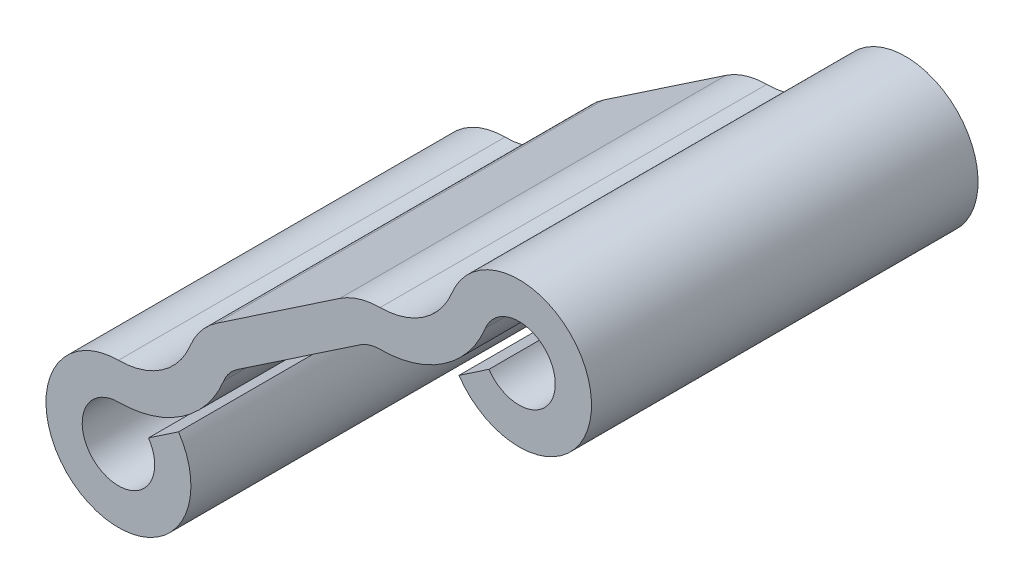
ISO-10303-21;
HEADER;
FILE_DESCRIPTION(('STEP AP214'),'2;1');
FILE_NAME('part.step','',(''),(''),'','','');
FILE_SCHEMA(('AUTOMOTIVE_DESIGN { 1 0 10303 214 1 1 1 1 }'));
ENDSEC;
DATA;
#1=APPLICATION_CONTEXT('core data for automotive mechanical design processes');
#2=APPLICATION_PROTOCOL_DEFINITION('international standard','automotive_design',2000,#1);
#3=PRODUCT_CONTEXT('',#1,'mechanical');
#4=PRODUCT('Part','Part','',(#3));
#5=PRODUCT_RELATED_PRODUCT_CATEGORY('part','',(#4));
#6=PRODUCT_DEFINITION_FORMATION('','',#4);
#7=PRODUCT_DEFINITION_CONTEXT('part definition',#1,'design');
#8=PRODUCT_DEFINITION('design','',#6,#7);
#9=PRODUCT_DEFINITION_SHAPE('','',#8);
#10=(LENGTH_UNIT() NAMED_UNIT(*) SI_UNIT(.MILLI.,.METRE.));
#11=(NAMED_UNIT(*) PLANE_ANGLE_UNIT() SI_UNIT($,.RADIAN.));
#12=(NAMED_UNIT(*) SI_UNIT($,.STERADIAN.) SOLID_ANGLE_UNIT());
#13=UNCERTAINTY_MEASURE_WITH_UNIT(LENGTH_MEASURE(1.E-05),#10,'distance_accuracy_value','');
#14=(GEOMETRIC_REPRESENTATION_CONTEXT(3) GLOBAL_UNCERTAINTY_ASSIGNED_CONTEXT((#13)) GLOBAL_UNIT_ASSIGNED_CONTEXT((#10,
#11,#12)) REPRESENTATION_CONTEXT('',''));
#15=CARTESIAN_POINT('',(0.,0.,0.));
#16=DIRECTION('',(0.,0.,1.));
#17=DIRECTION('',(1.,0.,0.));
#18=AXIS2_PLACEMENT_3D('',#15,#16,#17);
#19=CARTESIAN_POINT('',(0.,6.2,8.));
#20=DIRECTION('',(0.,0.,-1.));
#21=DIRECTION('',(0.927183854566791,-0.374606593415903,0.));
#22=AXIS2_PLACEMENT_3D('',#19,#20,#21);
#23=CYLINDRICAL_SURFACE('',#22,3.20000000000003);
#24=CARTESIAN_POINT('',(0.,6.2,-8.));
#25=DIRECTION('',(0.,0.,-1.));
#26=DIRECTION('',(0.927183854566791,-0.374606593415903,0.));
#27=AXIS2_PLACEMENT_3D('',#24,#25,#26);
#28=CIRCLE('',#27,3.20000000000003);
#29=CARTESIAN_POINT('',(0.,2.99999999999997,-8.));
#30=VERTEX_POINT('',#29);
#31=CARTESIAN_POINT('',(2.96698833461371,5.0012589010691,-8.));
#32=VERTEX_POINT('',#31);
#33=EDGE_CURVE('E127',#30,#32,#28,.F.);
#34=ORIENTED_EDGE('',*,*,#33,.F.);
#35=DIRECTION('',(0.,0.,1.));
#36=VECTOR('',#35,1.);
#37=CARTESIAN_POINT('',(0.,2.99999999999997,-8.));
#38=LINE('',#37,#36);
#39=CARTESIAN_POINT('',(0.,2.99999999999997,8.));
#40=VERTEX_POINT('',#39);
#41=EDGE_CURVE('E139',#40,#30,#38,.F.);
#42=ORIENTED_EDGE('',*,*,#41,.F.);
#43=CARTESIAN_POINT('',(0.,6.2,8.));
#44=DIRECTION('',(0.,0.,1.));
#45=DIRECTION('',(0.,-1.,0.));
#46=AXIS2_PLACEMENT_3D('',#43,#44,#45);
#47=CIRCLE('',#46,3.20000000000003);
#48=CARTESIAN_POINT('',(2.96698833461371,5.00125890106909,8.));
#49=VERTEX_POINT('',#48);
#50=EDGE_CURVE('E144',#40,#49,#47,.T.);
#51=ORIENTED_EDGE('',*,*,#50,.T.);
#52=DIRECTION('',(0.,0.,-1.));
#53=VECTOR('',#52,1.);
#54=CARTESIAN_POINT('',(2.96698833461371,5.00125890106909,8.));
#55=LINE('',#54,#53);
#56=EDGE_CURVE('E141',#49,#32,#55,.T.);
#57=ORIENTED_EDGE('',*,*,#56,.T.);
#58=EDGE_LOOP('',(#34,#42,#51,#57));
#59=FACE_BOUND('',#58,.T.);
#60=ADVANCED_FACE('F17',(#59),#23,.F.);
#61=CARTESIAN_POINT('',(5.7485398983147,3.87743912082089,8.));
#62=DIRECTION('',(0.,0.,-1.));
#63=DIRECTION('',(-0.927183854566763,0.374606593415972,0.));
#64=AXIS2_PLACEMENT_3D('',#61,#62,#63);
#65=CYLINDRICAL_SURFACE('',#64,3.00000000000077);
#66=CARTESIAN_POINT('',(5.7485398983147,3.87743912082089,-8.));
#67=DIRECTION('',(0.,0.,1.));
#68=DIRECTION('',(-0.559192903470824,0.82903757255499,0.));
#69=AXIS2_PLACEMENT_3D('',#66,#67,#68);
#70=CIRCLE('',#69,3.00000000000077);
#71=CARTESIAN_POINT('',(4.0709611879018,6.3645518384865,-8.));
#72=VERTEX_POINT('',#71);
#73=EDGE_CURVE('E155',#72,#32,#70,.T.);
#74=ORIENTED_EDGE('',*,*,#73,.T.);
#75=ORIENTED_EDGE('',*,*,#56,.F.);
#76=CARTESIAN_POINT('',(5.7485398983147,3.87743912082089,8.));
#77=DIRECTION('',(0.,0.,-1.));
#78=DIRECTION('',(-0.927183854566763,0.374606593415972,0.));
#79=AXIS2_PLACEMENT_3D('',#76,#77,#78);
#80=CIRCLE('',#79,3.00000000000077);
#81=CARTESIAN_POINT('',(4.0709611879018,6.3645518384865,8.));
#82=VERTEX_POINT('',#81);
#83=EDGE_CURVE('E159',#82,#49,#80,.F.);
#84=ORIENTED_EDGE('',*,*,#83,.F.);
#85=DIRECTION('',(0.,0.,-1.));
#86=VECTOR('',#85,1.);
#87=CARTESIAN_POINT('',(4.0709611879018,6.3645518384865,8.));
#88=LINE('',#87,#86);
#89=EDGE_CURVE('E163',#82,#72,#88,.T.);
#90=ORIENTED_EDGE('',*,*,#89,.T.);
#91=EDGE_LOOP('',(#74,#75,#84,#90));
#92=FACE_BOUND('',#91,.T.);
#93=ADVANCED_FACE('F403',(#92),#65,.T.);
#94=CARTESIAN_POINT('',(4.0709611879018,6.3645518384865,-8.));
#95=DIRECTION('',(-0.559192903470739,0.829037572555047,0.));
#96=DIRECTION('',(0.,0.,1.));
#97=AXIS2_PLACEMENT_3D('',#94,#95,#96);
#98=PLANE('',#97);
#99=DIRECTION('',(-0.829037572555047,-0.559192903470739,0.));
#100=VECTOR('',#99,1.);
#101=CARTESIAN_POINT('',(9.1546328423745,9.7935316662587,-8.));
#102=LINE('',#101,#100);
#103=CARTESIAN_POINT('',(9.1546328423745,9.7935316662587,-8.));
#104=VERTEX_POINT('',#103);
#105=EDGE_CURVE('E168',#104,#72,#102,.T.);
#106=ORIENTED_EDGE('',*,*,#105,.T.);
#107=ORIENTED_EDGE('',*,*,#89,.F.);
#108=DIRECTION('',(0.829037572555047,0.559192903470739,0.));
#109=VECTOR('',#108,1.);
#110=CARTESIAN_POINT('',(4.0709611879018,6.3645518384865,8.));
#111=LINE('',#110,#109);
#112=CARTESIAN_POINT('',(9.1546328423745,9.7935316662587,8.));
#113=VERTEX_POINT('',#112);
#114=EDGE_CURVE('E173',#113,#82,#111,.F.);
#115=ORIENTED_EDGE('',*,*,#114,.F.);
#116=DIRECTION('',(0.,0.,-1.));
#117=VECTOR('',#116,1.);
#118=CARTESIAN_POINT('',(9.1546328423745,9.7935316662587,8.));
#119=LINE('',#118,#117);
#120=EDGE_CURVE('E177',#113,#104,#119,.T.);
#121=ORIENTED_EDGE('',*,*,#120,.T.);
#122=EDGE_LOOP('',(#106,#107,#115,#121));
#123=FACE_BOUND('',#122,.T.);
#124=ADVANCED_FACE('F399',(#123),#98,.T.);
#125=CARTESIAN_POINT('',(10.8322115527868,7.30641894859602,8.));
#126=DIRECTION('',(0.,0.,-1.));
#127=DIRECTION('',(-0.559192903471129,0.829037572554784,0.));
#128=AXIS2_PLACEMENT_3D('',#125,#126,#127);
#129=CYLINDRICAL_SURFACE('',#128,2.99999999999799);
#130=CARTESIAN_POINT('',(10.8322115527868,7.30641894859602,-8.));
#131=DIRECTION('',(0.,0.,1.));
#132=DIRECTION('',(0.,1.,0.));
#133=AXIS2_PLACEMENT_3D('',#130,#131,#132);
#134=CIRCLE('',#133,2.99999999999799);
#135=CARTESIAN_POINT('',(10.832211552787,10.306418948594,-8.));
#136=VERTEX_POINT('',#135);
#137=EDGE_CURVE('E182',#136,#104,#134,.T.);
#138=ORIENTED_EDGE('',*,*,#137,.T.);
#139=ORIENTED_EDGE('',*,*,#120,.F.);
#140=CARTESIAN_POINT('',(10.8322115527868,7.30641894859602,8.));
#141=DIRECTION('',(0.,0.,-1.));
#142=DIRECTION('',(-0.559192903471129,0.829037572554784,0.));
#143=AXIS2_PLACEMENT_3D('',#140,#141,#142);
#144=CIRCLE('',#143,2.99999999999799);
#145=CARTESIAN_POINT('',(10.832211552787,10.306418948594,8.));
#146=VERTEX_POINT('',#145);
#147=EDGE_CURVE('E187',#146,#113,#144,.F.);
#148=ORIENTED_EDGE('',*,*,#147,.F.);
#149=DIRECTION('',(0.,0.,-1.));
#150=VECTOR('',#149,1.);
#151=CARTESIAN_POINT('',(10.832211552787,10.306418948594,8.));
#152=LINE('',#151,#150);
#153=EDGE_CURVE('E191',#146,#136,#152,.T.);
#154=ORIENTED_EDGE('',*,*,#153,.T.);
#155=EDGE_LOOP('',(#138,#139,#148,#154));
#156=FACE_BOUND('',#155,.T.);
#157=ADVANCED_FACE('F397',(#156),#129,.T.);
#158=CARTESIAN_POINT('',(10.8322115527892,13.5064189485897,8.));
#159=DIRECTION('',(0.,0.,-1.));
#160=DIRECTION('',(0.927183854567117,-0.374606593415096,0.));
#161=AXIS2_PLACEMENT_3D('',#158,#159,#160);
#162=CYLINDRICAL_SURFACE('',#161,3.19999999999571);
#163=CARTESIAN_POINT('',(10.8322115527892,13.5064189485897,-8.));
#164=DIRECTION('',(0.,0.,-1.));
#165=DIRECTION('',(0.927183854567117,-0.374606593415095,0.));
#166=AXIS2_PLACEMENT_3D('',#163,#164,#165);
#167=CIRCLE('',#166,3.19999999999571);
#168=CARTESIAN_POINT('',(13.7991998874,12.307677849663,-8.));
#169=VERTEX_POINT('',#168);
#170=EDGE_CURVE('E196',#136,#169,#167,.F.);
#171=ORIENTED_EDGE('',*,*,#170,.F.);
#172=ORIENTED_EDGE('',*,*,#153,.F.);
#173=CARTESIAN_POINT('',(10.8322115527892,13.5064189485897,8.));
#174=DIRECTION('',(0.,0.,1.));
#175=DIRECTION('',(-6.87228052243893E-13,-1.,0.));
#176=AXIS2_PLACEMENT_3D('',#173,#174,#175);
#177=CIRCLE('',#176,3.19999999999571);
#178=CARTESIAN_POINT('',(13.7991998874,12.307677849663,8.));
#179=VERTEX_POINT('',#178);
#180=EDGE_CURVE('E200',#146,#179,#177,.T.);
#181=ORIENTED_EDGE('',*,*,#180,.T.);
#182=DIRECTION('',(0.,0.,-1.));
#183=VECTOR('',#182,1.);
#184=CARTESIAN_POINT('',(13.7991998874,12.307677849663,8.));
#185=LINE('',#184,#183);
#186=EDGE_CURVE('E205',#179,#169,#185,.T.);
#187=ORIENTED_EDGE('',*,*,#186,.T.);
#188=EDGE_LOOP('',(#171,#172,#181,#187));
#189=FACE_BOUND('',#188,.T.);
#190=ADVANCED_FACE('F391',(#189),#162,.F.);
#191=CARTESIAN_POINT('',(16.5807514511008,11.1838580694158,8.));
#192=DIRECTION('',(0.,0.,-1.));
#193=DIRECTION('',(0.994521893156101,0.104528484315063,0.));
#194=AXIS2_PLACEMENT_3D('',#191,#192,#193);
#195=CYLINDRICAL_SURFACE('',#194,3.00000000000025);
#196=DIRECTION('',(0.,0.,-1.));
#197=VECTOR('',#196,1.);
#198=CARTESIAN_POINT('',(14.093638733436,9.5062793590027,8.));
#199=LINE('',#198,#197);
#200=CARTESIAN_POINT('',(14.093638733436,9.5062793590027,8.));
#201=VERTEX_POINT('',#200);
#202=CARTESIAN_POINT('',(14.093638733436,9.5062793590027,-8.));
#203=VERTEX_POINT('',#202);
#204=EDGE_CURVE('E210',#201,#203,#199,.T.);
#205=ORIENTED_EDGE('',*,*,#204,.T.);
#206=CARTESIAN_POINT('',(16.5807514511008,11.1838580694158,-8.));
#207=DIRECTION('',(0.,0.,1.));
#208=DIRECTION('',(-0.82903757255488,-0.559192903470986,0.));
#209=AXIS2_PLACEMENT_3D('',#206,#207,#208);
#210=CIRCLE('',#209,3.00000000000025);
#211=EDGE_CURVE('E215',#203,#169,#210,.T.);
#212=ORIENTED_EDGE('',*,*,#211,.T.);
#213=ORIENTED_EDGE('',*,*,#186,.F.);
#214=CARTESIAN_POINT('',(16.5807514511008,11.1838580694158,8.));
#215=DIRECTION('',(0.,0.,-1.));
#216=DIRECTION('',(-0.927183854566872,0.374606593415703,0.));
#217=AXIS2_PLACEMENT_3D('',#214,#215,#216);
#218=CIRCLE('',#217,3.00000000000025);
#219=EDGE_CURVE('E220',#201,#179,#218,.F.);
#220=ORIENTED_EDGE('',*,*,#219,.F.);
#221=EDGE_LOOP('',(#205,#212,#213,#220));
#222=FACE_BOUND('',#221,.T.);
#223=ADVANCED_FACE('F388',(#222),#195,.T.);
#224=CARTESIAN_POINT('',(14.093638733436,9.5062793590027,-8.));
#225=DIRECTION('',(-0.559192903471004,0.829037572554868,0.));
#226=DIRECTION('',(0.,0.,1.));
#227=AXIS2_PLACEMENT_3D('',#224,#225,#226);
#228=PLANE('',#227);
#229=DIRECTION('',(-0.829037572554869,-0.559192903471003,0.));
#230=VECTOR('',#229,1.);
#231=CARTESIAN_POINT('',(15.337195092268,10.345068714209,-8.));
#232=LINE('',#231,#230);
#233=CARTESIAN_POINT('',(15.337195092268,10.345068714209,-8.));
#234=VERTEX_POINT('',#233);
#235=EDGE_CURVE('E224',#234,#203,#232,.T.);
#236=ORIENTED_EDGE('',*,*,#235,.T.);
#237=ORIENTED_EDGE('',*,*,#204,.F.);
#238=DIRECTION('',(0.829037572554869,0.559192903471004,0.));
#239=VECTOR('',#238,1.);
#240=CARTESIAN_POINT('',(14.093638733436,9.5062793590027,8.));
#241=LINE('',#240,#239);
#242=CARTESIAN_POINT('',(15.337195092268,10.345068714209,8.));
#243=VERTEX_POINT('',#242);
#244=EDGE_CURVE('E229',#243,#201,#241,.F.);
#245=ORIENTED_EDGE('',*,*,#244,.F.);
#246=DIRECTION('',(0.,0.,-1.));
#247=VECTOR('',#246,1.);
#248=CARTESIAN_POINT('',(15.337195092268,10.345068714209,8.));
#249=LINE('',#248,#247);
#250=EDGE_CURVE('E233',#243,#234,#249,.T.);
#251=ORIENTED_EDGE('',*,*,#250,.T.);
#252=EDGE_LOOP('',(#236,#237,#245,#251));
#253=FACE_BOUND('',#252,.T.);
#254=ADVANCED_FACE('F383',(#253),#228,.T.);
#255=CARTESIAN_POINT('',(16.5807514511008,11.1838580694145,8.));
#256=DIRECTION('',(0.,0.,-1.));
#257=DIRECTION('',(-0.927183854566606,0.374606593416361,0.));
#258=AXIS2_PLACEMENT_3D('',#255,#256,#257);
#259=CYLINDRICAL_SURFACE('',#258,1.49999999999983);
#260=DIRECTION('',(0.,0.,-1.));
#261=VECTOR('',#260,1.);
#262=CARTESIAN_POINT('',(15.189975669251,11.745767959539,8.));
#263=LINE('',#262,#261);
#264=CARTESIAN_POINT('',(15.189975669251,11.745767959539,8.));
#265=VERTEX_POINT('',#264);
#266=CARTESIAN_POINT('',(15.189975669251,11.745767959539,-8.));
#267=VERTEX_POINT('',#266);
#268=EDGE_CURVE('E238',#265,#267,#263,.T.);
#269=ORIENTED_EDGE('',*,*,#268,.T.);
#270=CARTESIAN_POINT('',(16.5807514511008,11.1838580694145,-8.));
#271=DIRECTION('',(0.,0.,-1.));
#272=DIRECTION('',(-0.927183854566606,0.374606593416361,0.));
#273=AXIS2_PLACEMENT_3D('',#270,#271,#272);
#274=CIRCLE('',#273,1.49999999999983);
#275=EDGE_CURVE('E243',#234,#267,#274,.F.);
#276=ORIENTED_EDGE('',*,*,#275,.F.);
#277=ORIENTED_EDGE('',*,*,#250,.F.);
#278=CARTESIAN_POINT('',(16.5807514511008,11.1838580694145,8.));
#279=DIRECTION('',(0.,0.,1.));
#280=DIRECTION('',(-0.829037572555266,-0.559192903470415,0.));
#281=AXIS2_PLACEMENT_3D('',#278,#279,#280);
#282=CIRCLE('',#281,1.49999999999983);
#283=EDGE_CURVE('E247',#243,#265,#282,.T.);
#284=ORIENTED_EDGE('',*,*,#283,.T.);
#285=EDGE_LOOP('',(#269,#276,#277,#284));
#286=FACE_BOUND('',#285,.T.);
#287=ADVANCED_FACE('F380',(#286),#259,.F.);
#288=CARTESIAN_POINT('',(10.8322115527861,13.506418948595,8.));
#289=DIRECTION('',(0.,0.,-1.));
#290=DIRECTION('',(0.927183854566726,-0.374606593416065,0.));
#291=AXIS2_PLACEMENT_3D('',#288,#289,#290);
#292=CYLINDRICAL_SURFACE('',#291,4.70000000000143);
#293=CARTESIAN_POINT('',(10.8322115527861,13.506418948595,-8.));
#294=DIRECTION('',(0.,0.,1.));
#295=DIRECTION('',(1.99934631498393E-13,-1.,0.));
#296=AXIS2_PLACEMENT_3D('',#293,#294,#295);
#297=CIRCLE('',#296,4.70000000000143);
#298=CARTESIAN_POINT('',(10.832211552787,8.80641894859361,-8.));
#299=VERTEX_POINT('',#298);
#300=EDGE_CURVE('E252',#299,#267,#297,.T.);
#301=ORIENTED_EDGE('',*,*,#300,.T.);
#302=ORIENTED_EDGE('',*,*,#268,.F.);
#303=CARTESIAN_POINT('',(10.8322115527861,13.506418948595,8.));
#304=DIRECTION('',(0.,0.,-1.));
#305=DIRECTION('',(0.927183854566726,-0.374606593416065,0.));
#306=AXIS2_PLACEMENT_3D('',#303,#304,#305);
#307=CIRCLE('',#306,4.70000000000143);
#308=CARTESIAN_POINT('',(10.832211552787,8.80641894859361,8.));
#309=VERTEX_POINT('',#308);
#310=EDGE_CURVE('E257',#309,#265,#307,.F.);
#311=ORIENTED_EDGE('',*,*,#310,.F.);
#312=DIRECTION('',(0.,0.,-1.));
#313=VECTOR('',#312,1.);
#314=CARTESIAN_POINT('',(10.832211552787,8.80641894859361,8.));
#315=LINE('',#314,#313);
#316=EDGE_CURVE('E261',#309,#299,#315,.T.);
#317=ORIENTED_EDGE('',*,*,#316,.T.);
#318=EDGE_LOOP('',(#301,#302,#311,#317));
#319=FACE_BOUND('',#318,.T.);
#320=ADVANCED_FACE('F375',(#319),#292,.T.);
#321=CARTESIAN_POINT('',(10.8322115527879,7.30641894858964,8.));
#322=DIRECTION('',(0.,0.,-1.));
#323=DIRECTION('',(-0.559192903470043,0.829037572555516,0.));
#324=AXIS2_PLACEMENT_3D('',#321,#322,#323);
#325=CYLINDRICAL_SURFACE('',#324,1.50000000000396);
#326=CARTESIAN_POINT('',(10.8322115527879,7.30641894858964,-8.));
#327=DIRECTION('',(0.,0.,-1.));
#328=DIRECTION('',(-0.559192903470043,0.829037572555516,0.));
#329=AXIS2_PLACEMENT_3D('',#326,#327,#328);
#330=CIRCLE('',#329,1.50000000000396);
#331=CARTESIAN_POINT('',(9.9934221975806,8.5499753074262,-8.));
#332=VERTEX_POINT('',#331);
#333=EDGE_CURVE('E266',#299,#332,#330,.F.);
#334=ORIENTED_EDGE('',*,*,#333,.F.);
#335=ORIENTED_EDGE('',*,*,#316,.F.);
#336=CARTESIAN_POINT('',(10.8322115527879,7.30641894858964,8.));
#337=DIRECTION('',(0.,0.,1.));
#338=DIRECTION('',(-5.85013519107605E-13,1.,0.));
#339=AXIS2_PLACEMENT_3D('',#336,#337,#338);
#340=CIRCLE('',#339,1.50000000000396);
#341=CARTESIAN_POINT('',(9.9934221975806,8.5499753074262,8.));
#342=VERTEX_POINT('',#341);
#343=EDGE_CURVE('E270',#309,#342,#340,.T.);
#344=ORIENTED_EDGE('',*,*,#343,.T.);
#345=DIRECTION('',(0.,0.,-1.));
#346=VECTOR('',#345,1.);
#347=CARTESIAN_POINT('',(9.9934221975806,8.5499753074262,8.));
#348=LINE('',#347,#346);
#349=EDGE_CURVE('E275',#342,#332,#348,.T.);
#350=ORIENTED_EDGE('',*,*,#349,.T.);
#351=EDGE_LOOP('',(#334,#335,#344,#350));
#352=FACE_BOUND('',#351,.T.);
#353=ADVANCED_FACE('F373',(#352),#325,.F.);
#354=CARTESIAN_POINT('',(9.9934221975806,8.5499753074262,-8.));
#355=DIRECTION('',(0.559192903470758,-0.829037572555034,0.));
#356=DIRECTION('',(0.,0.,1.));
#357=AXIS2_PLACEMENT_3D('',#354,#355,#356);
#358=PLANE('',#357);
#359=DIRECTION('',(0.829037572555034,0.559192903470758,0.));
#360=VECTOR('',#359,1.);
#361=CARTESIAN_POINT('',(4.909750543108,5.1209954796539,-8.));
#362=LINE('',#361,#360);
#363=CARTESIAN_POINT('',(4.909750543108,5.1209954796539,-8.));
#364=VERTEX_POINT('',#363);
#365=EDGE_CURVE('E280',#364,#332,#362,.T.);
#366=ORIENTED_EDGE('',*,*,#365,.T.);
#367=ORIENTED_EDGE('',*,*,#349,.F.);
#368=DIRECTION('',(-0.829037572555034,-0.559192903470758,0.));
#369=VECTOR('',#368,1.);
#370=CARTESIAN_POINT('',(9.9934221975806,8.5499753074262,8.));
#371=LINE('',#370,#369);
#372=CARTESIAN_POINT('',(4.909750543108,5.1209954796539,8.));
#373=VERTEX_POINT('',#372);
#374=EDGE_CURVE('E285',#373,#342,#371,.F.);
#375=ORIENTED_EDGE('',*,*,#374,.F.);
#376=DIRECTION('',(0.,0.,-1.));
#377=VECTOR('',#376,1.);
#378=CARTESIAN_POINT('',(4.909750543108,5.1209954796539,8.));
#379=LINE('',#378,#377);
#380=EDGE_CURVE('E289',#373,#364,#379,.T.);
#381=ORIENTED_EDGE('',*,*,#380,.T.);
#382=EDGE_LOOP('',(#366,#367,#375,#381));
#383=FACE_BOUND('',#382,.T.);
#384=ADVANCED_FACE('F367',(#383),#358,.T.);
#385=CARTESIAN_POINT('',(5.74853989831345,3.87743912082181,8.));
#386=DIRECTION('',(0.,0.,-1.));
#387=DIRECTION('',(-0.92718385456684,0.374606593415781,0.));
#388=AXIS2_PLACEMENT_3D('',#385,#386,#387);
#389=CYLINDRICAL_SURFACE('',#388,1.49999999999923);
#390=CARTESIAN_POINT('',(5.74853989831345,3.87743912082181,-8.));
#391=DIRECTION('',(0.,0.,-1.));
#392=DIRECTION('',(-0.92718385456684,0.374606593415781,0.));
#393=AXIS2_PLACEMENT_3D('',#390,#391,#392);
#394=CIRCLE('',#393,1.49999999999923);
#395=CARTESIAN_POINT('',(4.3577641164639,4.43934901094519,-8.));
#396=VERTEX_POINT('',#395);
#397=EDGE_CURVE('E294',#364,#396,#394,.F.);
#398=ORIENTED_EDGE('',*,*,#397,.F.);
#399=ORIENTED_EDGE('',*,*,#380,.F.);
#400=CARTESIAN_POINT('',(5.74853989831345,3.87743912082181,8.));
#401=DIRECTION('',(0.,0.,1.));
#402=DIRECTION('',(-0.559192903470585,0.829037572555151,0.));
#403=AXIS2_PLACEMENT_3D('',#400,#401,#402);
#404=CIRCLE('',#403,1.49999999999923);
#405=CARTESIAN_POINT('',(4.3577641164639,4.43934901094519,8.));
#406=VERTEX_POINT('',#405);
#407=EDGE_CURVE('E298',#373,#406,#404,.T.);
#408=ORIENTED_EDGE('',*,*,#407,.T.);
#409=DIRECTION('',(0.,0.,-1.));
#410=VECTOR('',#409,1.);
#411=CARTESIAN_POINT('',(4.3577641164639,4.43934901094519,8.));
#412=LINE('',#411,#410);
#413=EDGE_CURVE('E303',#406,#396,#412,.T.);
#414=ORIENTED_EDGE('',*,*,#413,.T.);
#415=EDGE_LOOP('',(#398,#399,#408,#414));
#416=FACE_BOUND('',#415,.T.);
#417=ADVANCED_FACE('F365',(#416),#389,.F.);
#418=CARTESIAN_POINT('',(0.,6.2,8.));
#419=DIRECTION('',(0.,0.,-1.));
#420=DIRECTION('',(0.927183854566786,-0.374606593415915,0.));
#421=AXIS2_PLACEMENT_3D('',#418,#419,#420);
#422=CYLINDRICAL_SURFACE('',#421,4.7);
#423=CARTESIAN_POINT('',(0.,6.2,-8.));
#424=DIRECTION('',(0.,0.,1.));
#425=DIRECTION('',(0.,-1.,0.));
#426=AXIS2_PLACEMENT_3D('',#423,#424,#425);
#427=CIRCLE('',#426,4.7);
#428=CARTESIAN_POINT('',(0.,1.5,-8.));
#429=VERTEX_POINT('',#428);
#430=EDGE_CURVE('E308',#429,#396,#427,.T.);
#431=ORIENTED_EDGE('',*,*,#430,.T.);
#432=ORIENTED_EDGE('',*,*,#413,.F.);
#433=CARTESIAN_POINT('',(0.,6.2,8.));
#434=DIRECTION('',(0.,0.,-1.));
#435=DIRECTION('',(0.927183854566787,-0.374606593415913,0.));
#436=AXIS2_PLACEMENT_3D('',#433,#434,#435);
#437=CIRCLE('',#436,4.7);
#438=CARTESIAN_POINT('',(0.,1.5,8.));
#439=VERTEX_POINT('',#438);
#440=EDGE_CURVE('E313',#439,#406,#437,.F.);
#441=ORIENTED_EDGE('',*,*,#440,.F.);
#442=DIRECTION('',(0.,0.,-1.));
#443=VECTOR('',#442,1.);
#444=CARTESIAN_POINT('',(0.,1.5,8.));
#445=LINE('',#444,#443);
#446=EDGE_CURVE('E317',#439,#429,#445,.T.);
#447=ORIENTED_EDGE('',*,*,#446,.T.);
#448=EDGE_LOOP('',(#431,#432,#441,#447));
#449=FACE_BOUND('',#448,.T.);
#450=ADVANCED_FACE('F359',(#449),#422,.T.);
#451=CARTESIAN_POINT('',(0.,0.,8.));
#452=DIRECTION('',(0.,0.,-1.));
#453=DIRECTION('',(0.829037572555039,0.559192903470751,0.));
#454=AXIS2_PLACEMENT_3D('',#451,#452,#453);
#455=CYLINDRICAL_SURFACE('',#454,1.5);
#456=DIRECTION('',(0.,0.,-1.));
#457=VECTOR('',#456,1.);
#458=CARTESIAN_POINT('',(1.24355635883259,0.838789355206113,8.));
#459=LINE('',#458,#457);
#460=CARTESIAN_POINT('',(1.24355635883259,0.838789355206112,8.));
#461=VERTEX_POINT('',#460);
#462=CARTESIAN_POINT('',(1.24355635883259,0.838789355206113,-8.));
#463=VERTEX_POINT('',#462);
#464=EDGE_CURVE('E322',#461,#463,#459,.T.);
#465=ORIENTED_EDGE('',*,*,#464,.T.);
#466=CARTESIAN_POINT('',(0.,0.,-8.));
#467=DIRECTION('',(0.,0.,-1.));
#468=DIRECTION('',(0.82903757255504,0.55919290347075,0.));
#469=AXIS2_PLACEMENT_3D('',#466,#467,#468);
#470=CIRCLE('',#469,1.5);
#471=EDGE_CURVE('E327',#429,#463,#470,.F.);
#472=ORIENTED_EDGE('',*,*,#471,.F.);
#473=ORIENTED_EDGE('',*,*,#446,.F.);
#474=CARTESIAN_POINT('',(0.,0.,8.));
#475=DIRECTION('',(0.,0.,1.));
#476=DIRECTION('',(0.,1.,0.));
#477=AXIS2_PLACEMENT_3D('',#474,#475,#476);
#478=CIRCLE('',#477,1.5);
#479=EDGE_CURVE('E331',#439,#461,#478,.T.);
#480=ORIENTED_EDGE('',*,*,#479,.T.);
#481=EDGE_LOOP('',(#465,#472,#473,#480));
#482=FACE_BOUND('',#481,.T.);
#483=ADVANCED_FACE('F356',(#482),#455,.F.);
#484=CARTESIAN_POINT('',(1.24355635883259,0.838789355206114,-8.));
#485=DIRECTION('',(-0.559192903470748,0.829037572555041,0.));
#486=DIRECTION('',(0.,0.,1.));
#487=AXIS2_PLACEMENT_3D('',#484,#485,#486);
#488=PLANE('',#487);
#489=DIRECTION('',(-0.829037572555041,-0.559192903470748,0.));
#490=VECTOR('',#489,1.);
#491=CARTESIAN_POINT('',(2.4871127176651,1.6775787104122,-8.));
#492=LINE('',#491,#490);
#493=CARTESIAN_POINT('',(2.4871127176651,1.6775787104122,-8.));
#494=VERTEX_POINT('',#493);
#495=EDGE_CURVE('E33',#494,#463,#492,.T.);
#496=ORIENTED_EDGE('',*,*,#495,.T.);
#497=ORIENTED_EDGE('',*,*,#464,.F.);
#498=DIRECTION('',(0.829037572555041,0.559192903470748,0.));
#499=VECTOR('',#498,1.);
#500=CARTESIAN_POINT('',(1.24355635883259,0.838789355206114,8.));
#501=LINE('',#500,#499);
#502=CARTESIAN_POINT('',(2.4871127176651,1.6775787104122,8.));
#503=VERTEX_POINT('',#502);
#504=EDGE_CURVE('E339',#503,#461,#501,.F.);
#505=ORIENTED_EDGE('',*,*,#504,.F.);
#506=DIRECTION('',(0.,0.,-1.));
#507=VECTOR('',#506,1.);
#508=CARTESIAN_POINT('',(2.4871127176651,1.6775787104122,8.));
#509=LINE('',#508,#507);
#510=EDGE_CURVE('E133',#503,#494,#509,.T.);
#511=ORIENTED_EDGE('',*,*,#510,.T.);
#512=EDGE_LOOP('',(#496,#497,#505,#511));
#513=FACE_BOUND('',#512,.T.);
#514=ADVANCED_FACE('F350',(#513),#488,.T.);
#515=CARTESIAN_POINT('',(0.,0.,8.));
#516=DIRECTION('',(0.,0.,-1.));
#517=DIRECTION('',(-0.469471562785905,-0.882947592858919,0.));
#518=AXIS2_PLACEMENT_3D('',#515,#516,#517);
#519=CYLINDRICAL_SURFACE('',#518,3.);
#520=ORIENTED_EDGE('',*,*,#41,.T.);
#521=CARTESIAN_POINT('',(0.,0.,-8.));
#522=DIRECTION('',(0.,0.,1.));
#523=DIRECTION('',(0.,1.,0.));
#524=AXIS2_PLACEMENT_3D('',#521,#522,#523);
#525=CIRCLE('',#524,3.);
#526=EDGE_CURVE('E26',#30,#494,#525,.T.);
#527=ORIENTED_EDGE('',*,*,#526,.T.);
#528=ORIENTED_EDGE('',*,*,#510,.F.);
#529=CARTESIAN_POINT('',(0.,0.,8.));
#530=DIRECTION('',(0.,0.,-1.));
#531=DIRECTION('',(0.82903757255505,0.559192903470734,0.));
#532=AXIS2_PLACEMENT_3D('',#529,#530,#531);
#533=CIRCLE('',#532,3.);
#534=EDGE_CURVE('E11',#40,#503,#533,.F.);
#535=ORIENTED_EDGE('',*,*,#534,.F.);
#536=EDGE_LOOP('',(#520,#527,#528,#535));
#537=FACE_BOUND('',#536,.T.);
#538=ADVANCED_FACE('F143',(#537),#519,.T.);
#539=CARTESIAN_POINT('',(-2.99991968458111,-3.03095954235383,8.));
#540=DIRECTION('',(0.,0.,1.));
#541=DIRECTION('',(1.,0.,0.));
#542=AXIS2_PLACEMENT_3D('',#539,#540,#541);
#543=PLANE('',#542);
#544=ORIENTED_EDGE('',*,*,#50,.F.);
#545=ORIENTED_EDGE('',*,*,#534,.T.);
#546=ORIENTED_EDGE('',*,*,#504,.T.);
#547=ORIENTED_EDGE('',*,*,#479,.F.);
#548=ORIENTED_EDGE('',*,*,#440,.T.);
#549=ORIENTED_EDGE('',*,*,#407,.F.);
#550=ORIENTED_EDGE('',*,*,#374,.T.);
#551=ORIENTED_EDGE('',*,*,#343,.F.);
#552=ORIENTED_EDGE('',*,*,#310,.T.);
#553=ORIENTED_EDGE('',*,*,#283,.F.);
#554=ORIENTED_EDGE('',*,*,#244,.T.);
#555=ORIENTED_EDGE('',*,*,#219,.T.);
#556=ORIENTED_EDGE('',*,*,#180,.F.);
#557=ORIENTED_EDGE('',*,*,#147,.T.);
#558=ORIENTED_EDGE('',*,*,#114,.T.);
#559=ORIENTED_EDGE('',*,*,#83,.T.);
#560=EDGE_LOOP('',(#544,#545,#546,#547,#548,#549,#550,#551,#552,#553,#554,#555,#556,#557,#558,#559));
#561=FACE_BOUND('',#560,.T.);
#562=ADVANCED_FACE('F352',(#561),#543,.T.);
#563=CARTESIAN_POINT('',(-3.02493557462036,-3.05776264929282,-8.));
#564=DIRECTION('',(0.,0.,-1.));
#565=DIRECTION('',(0.,1.,0.));
#566=AXIS2_PLACEMENT_3D('',#563,#564,#565);
#567=PLANE('',#566);
#568=ORIENTED_EDGE('',*,*,#526,.F.);
#569=ORIENTED_EDGE('',*,*,#33,.T.);
#570=ORIENTED_EDGE('',*,*,#73,.F.);
#571=ORIENTED_EDGE('',*,*,#105,.F.);
#572=ORIENTED_EDGE('',*,*,#137,.F.);
#573=ORIENTED_EDGE('',*,*,#170,.T.);
#574=ORIENTED_EDGE('',*,*,#211,.F.);
#575=ORIENTED_EDGE('',*,*,#235,.F.);
#576=ORIENTED_EDGE('',*,*,#275,.T.);
#577=ORIENTED_EDGE('',*,*,#300,.F.);
#578=ORIENTED_EDGE('',*,*,#333,.T.);
#579=ORIENTED_EDGE('',*,*,#365,.F.);
#580=ORIENTED_EDGE('',*,*,#397,.T.);
#581=ORIENTED_EDGE('',*,*,#430,.F.);
#582=ORIENTED_EDGE('',*,*,#471,.T.);
#583=ORIENTED_EDGE('',*,*,#495,.F.);
#584=EDGE_LOOP('',(#568,#569,#570,#571,#572,#573,#574,#575,#576,#577,#578,#579,#580,#581,#582,#583));
#585=FACE_BOUND('',#584,.T.);
#586=ADVANCED_FACE('F19',(#585),#567,.T.);
#587=CLOSED_SHELL('',(#60,#93,#124,#157,#190,#223,#254,#287,#320,#353,#384,#417,#450,#483,#514,
#538,#562,#586));
#588=MANIFOLD_SOLID_BREP('B1',#587);
#589=ADVANCED_BREP_SHAPE_REPRESENTATION('',(#18,#588),#14);
#590=SHAPE_DEFINITION_REPRESENTATION(#9,#589);
ENDSEC;
END-ISO-10303-21;
